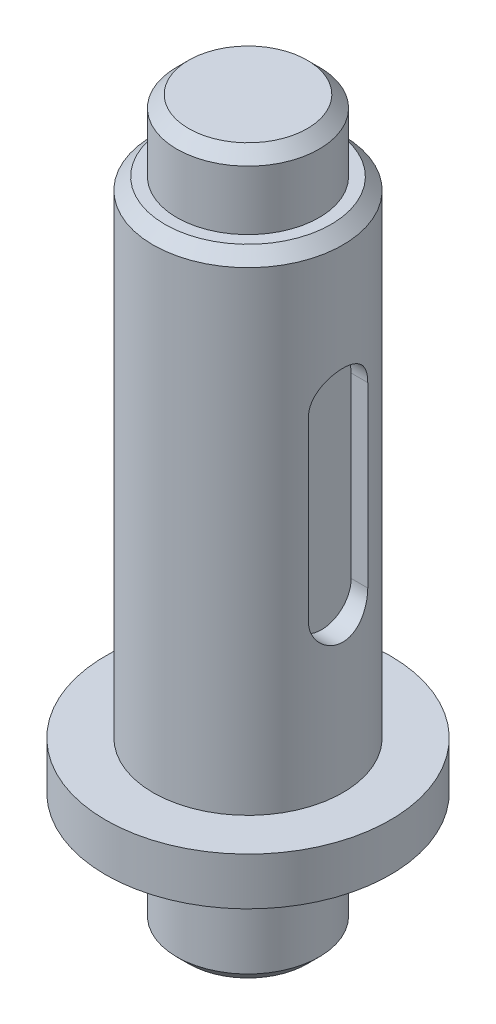
ISO-10303-21;
HEADER;
FILE_DESCRIPTION(('STEP AP214'),'2;1');
FILE_NAME('part.step','',(''),(''),'','','');
FILE_SCHEMA(('AUTOMOTIVE_DESIGN { 1 0 10303 214 1 1 1 1 }'));
ENDSEC;
DATA;
#1=APPLICATION_CONTEXT('core data for automotive mechanical design processes');
#2=APPLICATION_PROTOCOL_DEFINITION('international standard','automotive_design',2000,#1);
#3=PRODUCT_CONTEXT('',#1,'mechanical');
#4=PRODUCT('Part','Part','',(#3));
#5=PRODUCT_RELATED_PRODUCT_CATEGORY('part','',(#4));
#6=PRODUCT_DEFINITION_FORMATION('','',#4);
#7=PRODUCT_DEFINITION_CONTEXT('part definition',#1,'design');
#8=PRODUCT_DEFINITION('design','',#6,#7);
#9=PRODUCT_DEFINITION_SHAPE('','',#8);
#10=(LENGTH_UNIT() NAMED_UNIT(*) SI_UNIT(.MILLI.,.METRE.));
#11=(NAMED_UNIT(*) PLANE_ANGLE_UNIT() SI_UNIT($,.RADIAN.));
#12=(NAMED_UNIT(*) SI_UNIT($,.STERADIAN.) SOLID_ANGLE_UNIT());
#13=UNCERTAINTY_MEASURE_WITH_UNIT(LENGTH_MEASURE(1.E-05),#10,'distance_accuracy_value','');
#14=(GEOMETRIC_REPRESENTATION_CONTEXT(3) GLOBAL_UNCERTAINTY_ASSIGNED_CONTEXT((#13)) GLOBAL_UNIT_ASSIGNED_CONTEXT((#10,
#11,#12)) REPRESENTATION_CONTEXT('',''));
#15=CARTESIAN_POINT('',(0.,0.,0.));
#16=DIRECTION('',(0.,0.,1.));
#17=DIRECTION('',(1.,0.,0.));
#18=AXIS2_PLACEMENT_3D('',#15,#16,#17);
#19=CARTESIAN_POINT('',(0.,10.,0.));
#20=DIRECTION('',(0.,-1.,0.));
#21=DIRECTION('',(0.,0.,-1.));
#22=AXIS2_PLACEMENT_3D('',#19,#20,#21);
#23=CYLINDRICAL_SURFACE('',#22,6.);
#24=CARTESIAN_POINT('',(0.,1.00000000000001,0.));
#25=DIRECTION('',(0.,1.,0.));
#26=DIRECTION('',(0.,0.,1.));
#27=AXIS2_PLACEMENT_3D('',#24,#25,#26);
#28=CIRCLE('',#27,6.);
#29=CARTESIAN_POINT('',(0.,1.00000000000001,6.));
#30=VERTEX_POINT('',#29);
#31=EDGE_CURVE('E108',#30,#30,#28,.T.);
#32=ORIENTED_EDGE('',*,*,#31,.T.);
#33=EDGE_LOOP('',(#32));
#34=FACE_BOUND('',#33,.T.);
#35=CARTESIAN_POINT('',(0.,10.,0.));
#36=DIRECTION('',(0.,1.,0.));
#37=DIRECTION('',(0.,0.,1.));
#38=AXIS2_PLACEMENT_3D('',#35,#36,#37);
#39=CIRCLE('',#38,6.);
#40=CARTESIAN_POINT('',(0.,10.,6.));
#41=VERTEX_POINT('',#40);
#42=EDGE_CURVE('E112',#41,#41,#39,.T.);
#43=ORIENTED_EDGE('',*,*,#42,.F.);
#44=EDGE_LOOP('',(#43));
#45=FACE_BOUND('',#44,.T.);
#46=ADVANCED_FACE('F34',(#34,#45),#23,.T.);
#47=CARTESIAN_POINT('',(0.,0.,0.));
#48=DIRECTION('',(0.,1.,0.));
#49=DIRECTION('',(0.,0.,1.));
#50=AXIS2_PLACEMENT_3D('',#47,#48,#49);
#51=PLANE('',#50);
#52=CARTESIAN_POINT('',(0.,0.,0.));
#53=DIRECTION('',(0.,1.,0.));
#54=DIRECTION('',(0.,0.,1.));
#55=AXIS2_PLACEMENT_3D('',#52,#53,#54);
#56=CIRCLE('',#55,4.99999999999999);
#57=CARTESIAN_POINT('',(0.,0.,4.99999999999999));
#58=VERTEX_POINT('',#57);
#59=EDGE_CURVE('E122',#58,#58,#56,.F.);
#60=ORIENTED_EDGE('',*,*,#59,.T.);
#61=EDGE_LOOP('',(#60));
#62=FACE_BOUND('',#61,.T.);
#63=ADVANCED_FACE('F185',(#62),#51,.F.);
#64=CARTESIAN_POINT('',(0.,14.,0.));
#65=DIRECTION('',(0.,-1.,0.));
#66=DIRECTION('',(0.,0.,-1.));
#67=AXIS2_PLACEMENT_3D('',#64,#65,#66);
#68=CYLINDRICAL_SURFACE('',#67,12.);
#69=CARTESIAN_POINT('',(0.,14.,0.));
#70=DIRECTION('',(0.,1.,0.));
#71=DIRECTION('',(0.,0.,1.));
#72=AXIS2_PLACEMENT_3D('',#69,#70,#71);
#73=CIRCLE('',#72,12.);
#74=CARTESIAN_POINT('',(0.,14.,12.));
#75=VERTEX_POINT('',#74);
#76=EDGE_CURVE('E113',#75,#75,#73,.T.);
#77=ORIENTED_EDGE('',*,*,#76,.F.);
#78=EDGE_LOOP('',(#77));
#79=FACE_BOUND('',#78,.T.);
#80=CARTESIAN_POINT('',(0.,10.,0.));
#81=DIRECTION('',(0.,1.,0.));
#82=DIRECTION('',(0.,0.,1.));
#83=AXIS2_PLACEMENT_3D('',#80,#81,#82);
#84=CIRCLE('',#83,12.);
#85=CARTESIAN_POINT('',(0.,10.,12.));
#86=VERTEX_POINT('',#85);
#87=EDGE_CURVE('E101',#86,#86,#84,.T.);
#88=ORIENTED_EDGE('',*,*,#87,.T.);
#89=EDGE_LOOP('',(#88));
#90=FACE_BOUND('',#89,.T.);
#91=ADVANCED_FACE('F191',(#79,#90),#68,.T.);
#92=CARTESIAN_POINT('',(0.,14.,0.));
#93=DIRECTION('',(0.,1.,0.));
#94=DIRECTION('',(0.,0.,1.));
#95=AXIS2_PLACEMENT_3D('',#92,#93,#94);
#96=PLANE('',#95);
#97=CARTESIAN_POINT('',(0.,14.,0.));
#98=DIRECTION('',(0.,1.,0.));
#99=DIRECTION('',(0.,0.,1.));
#100=AXIS2_PLACEMENT_3D('',#97,#98,#99);
#101=CIRCLE('',#100,8.);
#102=CARTESIAN_POINT('',(0.,14.,8.));
#103=VERTEX_POINT('',#102);
#104=EDGE_CURVE('E109',#103,#103,#101,.T.);
#105=ORIENTED_EDGE('',*,*,#104,.F.);
#106=EDGE_LOOP('',(#105));
#107=FACE_BOUND('',#106,.T.);
#108=ORIENTED_EDGE('',*,*,#76,.T.);
#109=EDGE_LOOP('',(#108));
#110=FACE_BOUND('',#109,.T.);
#111=ADVANCED_FACE('F226',(#107,#110),#96,.T.);
#112=CARTESIAN_POINT('',(0.,10.,0.));
#113=DIRECTION('',(0.,1.,0.));
#114=DIRECTION('',(0.,0.,1.));
#115=AXIS2_PLACEMENT_3D('',#112,#113,#114);
#116=PLANE('',#115);
#117=ORIENTED_EDGE('',*,*,#42,.T.);
#118=EDGE_LOOP('',(#117));
#119=FACE_BOUND('',#118,.T.);
#120=ORIENTED_EDGE('',*,*,#87,.F.);
#121=EDGE_LOOP('',(#120));
#122=FACE_BOUND('',#121,.T.);
#123=ADVANCED_FACE('F181',(#119,#122),#116,.F.);
#124=CARTESIAN_POINT('',(0.,55.,0.));
#125=DIRECTION('',(0.,-1.,0.));
#126=DIRECTION('',(0.,0.,-1.));
#127=AXIS2_PLACEMENT_3D('',#124,#125,#126);
#128=CYLINDRICAL_SURFACE('',#127,8.);
#129=DIRECTION('',(0.,-1.,0.));
#130=VECTOR('',#129,1.);
#131=CARTESIAN_POINT('',(7.59934207678533,55.,-2.5));
#132=LINE('',#131,#130);
#133=CARTESIAN_POINT('',(7.59934207678533,42.5,-2.5));
#134=VERTEX_POINT('',#133);
#135=CARTESIAN_POINT('',(7.59934207678533,27.5,-2.5));
#136=VERTEX_POINT('',#135);
#137=EDGE_CURVE('E11',#134,#136,#132,.T.);
#138=ORIENTED_EDGE('',*,*,#137,.T.);
#139=CARTESIAN_POINT('',(7.59934207678533,27.5,-2.5));
#140=CARTESIAN_POINT('',(7.59933203220922,27.431533959542,-2.50000871986611));
#141=CARTESIAN_POINT('',(7.60026710840752,27.3630736199713,-2.4971876157067));
#142=CARTESIAN_POINT('',(7.60395280971297,27.2266785097404,-2.48595363160138));
#143=CARTESIAN_POINT('',(7.60670299725467,27.1587436164041,-2.47754209932593));
#144=CARTESIAN_POINT('',(7.61393458112745,27.0240610094841,-2.45522504986812));
#145=CARTESIAN_POINT('',(7.61841131278036,26.9573105997033,-2.44133433374918));
#146=CARTESIAN_POINT('',(7.6289504842887,26.8252980221065,-2.40819742021323));
#147=CARTESIAN_POINT('',(7.63501297127917,26.760035898591,-2.38895106360389));
#148=CARTESIAN_POINT('',(7.65531370854753,26.5672122235932,-2.32342181812057));
#149=CARTESIAN_POINT('',(7.67167572075674,26.4424319419261,-2.26931834783614));
#150=CARTESIAN_POINT('',(7.70820192005305,26.2037124302177,-2.1419585337528));
#151=CARTESIAN_POINT('',(7.72836808096863,26.0897788745153,-2.06869223942944));
#152=CARTESIAN_POINT('',(7.77100200100207,25.8720500238271,-1.90239488450143));
#153=CARTESIAN_POINT('',(7.79352168290434,25.7686777356114,-1.80882220629732));
#154=CARTESIAN_POINT('',(7.83788426191899,25.5788091827044,-1.60572727956463));
#155=CARTESIAN_POINT('',(7.85972704204464,25.4923158216107,-1.49620229248912));
#156=CARTESIAN_POINT('',(7.90087147079049,25.3367767359159,-1.26124953771773));
#157=CARTESIAN_POINT('',(7.92010445950432,25.2681699526331,-1.13551807880448));
#158=CARTESIAN_POINT('',(7.95325160259884,25.1532459150217,-0.873602960335169));
#159=CARTESIAN_POINT('',(7.96716721976608,25.106922529715,-0.737422187737948));
#160=CARTESIAN_POINT('',(7.98774341182992,25.0392981140107,-0.462930099011999));
#161=CARTESIAN_POINT('',(7.99461464054537,25.0172689552531,-0.324814247508668));
#162=CARTESIAN_POINT('',(8.00107192504111,24.9965512744954,-0.0466844774607918));
#163=CARTESIAN_POINT('',(8.00065948912979,24.9978579200948,0.0933290421121669));
#164=CARTESIAN_POINT('',(7.99274230032515,25.0232966545975,0.366149731450021));
#165=CARTESIAN_POINT('',(7.98548293529422,25.0466390281483,0.499038795981164));
#166=CARTESIAN_POINT('',(7.96498949974384,25.1141904955611,0.758907586787322));
#167=CARTESIAN_POINT('',(7.95175510801139,25.1584007112687,0.885886994958718));
#168=CARTESIAN_POINT('',(7.92046911120711,25.2669406330595,1.13215685546553));
#169=CARTESIAN_POINT('',(7.90236047967987,25.33151017529,1.2513340594516));
#170=CARTESIAN_POINT('',(7.86323423851861,25.478743196476,1.47740616192354));
#171=CARTESIAN_POINT('',(7.84221592430771,25.5614110607507,1.58429807402893));
#172=CARTESIAN_POINT('',(7.79847545376802,25.7465381363962,1.78746586607462));
#173=CARTESIAN_POINT('',(7.77571879037653,25.8496774077316,1.88311543585898));
#174=CARTESIAN_POINT('',(7.73181622612155,26.0707703101051,2.05596538849195));
#175=CARTESIAN_POINT('',(7.71067081193134,26.1887283888502,2.13316021206709));
#176=CARTESIAN_POINT('',(7.67220528704821,26.4379029431861,2.26764925997605));
#177=CARTESIAN_POINT('',(7.65493278862476,26.5692583014659,2.32470027293309));
#178=CARTESIAN_POINT('',(7.62673815128782,26.8403118730474,2.41560912229749));
#179=CARTESIAN_POINT('',(7.61580620458632,26.9799968306881,2.44950279382811));
#180=CARTESIAN_POINT('',(7.60564225124819,27.1841751010082,2.48078343133095));
#181=CARTESIAN_POINT('',(7.60328541577438,27.2471449369418,2.48798807259048));
#182=CARTESIAN_POINT('',(7.60013482131107,27.3733989933458,2.49759244704775));
#183=CARTESIAN_POINT('',(7.59933885501905,27.4366826427974,2.4999989655896));
#184=CARTESIAN_POINT('',(7.59934207678533,27.5,2.5));
#185=B_SPLINE_CURVE_WITH_KNOTS('',3,(#139,#140,#141,#142,#143,#144,#145,#146,#147,#148,#149,
#150,#151,#152,#153,#154,#155,#156,#157,#158,#159,#160,#161,#162,#163,#164,#165,#166,#167,#168,
#169,#170,#171,#172,#173,#174,#175,#176,#177,#178,#179,#180,#181,#182,#183,#184),.UNSPECIFIED.,
.F.,.F.,(4,2,2,2,2,2,2,2,2,2,2,2,2,2,2,2,2,2,2,2,2,2,4),(0.,0.205323959879022,0.410598440771334,
0.615322164613759,0.820051974362703,1.22896577749256,1.63809233699274,2.05988351400979,
2.48174718582288,2.91315381297358,3.34444167638914,3.7624189439242,4.18030965733328,
4.58377069824372,4.98725343150324,5.39567896994655,5.80420358180209,6.2297165423683,
6.6553575226076,7.0859747210149,7.51592403685477,7.70602799872316,7.89586293072483),.UNSPECIFIED.);
#186=CARTESIAN_POINT('',(7.59934207678533,27.5,2.5));
#187=VERTEX_POINT('',#186);
#188=EDGE_CURVE('E137',#136,#187,#185,.T.);
#189=ORIENTED_EDGE('',*,*,#188,.T.);
#190=DIRECTION('',(0.,-1.,0.));
#191=VECTOR('',#190,1.);
#192=CARTESIAN_POINT('',(7.59934207678533,55.,2.5));
#193=LINE('',#192,#191);
#194=CARTESIAN_POINT('',(7.59934207678533,42.5,2.5));
#195=VERTEX_POINT('',#194);
#196=EDGE_CURVE('E43',#187,#195,#193,.F.);
#197=ORIENTED_EDGE('',*,*,#196,.T.);
#198=CARTESIAN_POINT('',(7.59934207678533,42.5,2.5));
#199=CARTESIAN_POINT('',(7.59933203220923,42.5684660404579,2.5000087198661));
#200=CARTESIAN_POINT('',(7.60026710840753,42.6369263800287,2.4971876157067));
#201=CARTESIAN_POINT('',(7.60395280971297,42.7733214902596,2.48595363160137));
#202=CARTESIAN_POINT('',(7.60670299725468,42.8412563835959,2.47754209932592));
#203=CARTESIAN_POINT('',(7.61393458112745,42.9759389905158,2.45522504986811));
#204=CARTESIAN_POINT('',(7.61841131278037,43.0426894002966,2.44133433374918));
#205=CARTESIAN_POINT('',(7.6289504842887,43.1747019778935,2.40819742021322));
#206=CARTESIAN_POINT('',(7.63501297127917,43.2399641014089,2.38895106360388));
#207=CARTESIAN_POINT('',(7.65531370854753,43.4327877764068,2.32342181812057));
#208=CARTESIAN_POINT('',(7.67167572075674,43.5575680580739,2.26931834783614));
#209=CARTESIAN_POINT('',(7.70820192005305,43.7962875697823,2.1419585337528));
#210=CARTESIAN_POINT('',(7.72836808096863,43.9102211254847,2.06869223942944));
#211=CARTESIAN_POINT('',(7.77100200100207,44.1279499761729,1.90239488450142));
#212=CARTESIAN_POINT('',(7.79352168290434,44.2313222643886,1.80882220629731));
#213=CARTESIAN_POINT('',(7.83788426191899,44.4211908172956,1.60572727956463));
#214=CARTESIAN_POINT('',(7.85972704204464,44.5076841783893,1.49620229248911));
#215=CARTESIAN_POINT('',(7.90087147079049,44.6632232640841,1.26124953771773));
#216=CARTESIAN_POINT('',(7.92010445950432,44.7318300473669,1.13551807880448));
#217=CARTESIAN_POINT('',(7.95325160259884,44.8467540849783,0.87360296033517));
#218=CARTESIAN_POINT('',(7.96716721976608,44.893077470285,0.737422187737948));
#219=CARTESIAN_POINT('',(7.98774341182992,44.9607018859892,0.462930099011998));
#220=CARTESIAN_POINT('',(7.99461464054537,44.9827310447469,0.324814247508667));
#221=CARTESIAN_POINT('',(8.00107192504111,45.0034487255046,0.0466844774607901));
#222=CARTESIAN_POINT('',(8.00065948912979,45.0021420799052,-0.0933290421121691));
#223=CARTESIAN_POINT('',(7.99274230032515,44.9767033454025,-0.366149731450024));
#224=CARTESIAN_POINT('',(7.98548293529422,44.9533609718517,-0.499038795981168));
#225=CARTESIAN_POINT('',(7.96498949974384,44.8858095044389,-0.758907586787326));
#226=CARTESIAN_POINT('',(7.95175510801139,44.8415992887313,-0.885886994958722));
#227=CARTESIAN_POINT('',(7.92046911120711,44.7330593669404,-1.13215685546553));
#228=CARTESIAN_POINT('',(7.90236047967987,44.66848982471,-1.2513340594516));
#229=CARTESIAN_POINT('',(7.86323423851861,44.521256803524,-1.47740616192355));
#230=CARTESIAN_POINT('',(7.84221592430771,44.4385889392493,-1.58429807402893));
#231=CARTESIAN_POINT('',(7.79847545376802,44.2534618636038,-1.78746586607462));
#232=CARTESIAN_POINT('',(7.77571879037652,44.1503225922683,-1.88311543585898));
#233=CARTESIAN_POINT('',(7.73181622612155,43.9292296898949,-2.05596538849195));
#234=CARTESIAN_POINT('',(7.71067081193134,43.8112716111498,-2.13316021206709));
#235=CARTESIAN_POINT('',(7.67220528704821,43.5620970568139,-2.26764925997605));
#236=CARTESIAN_POINT('',(7.65493278862476,43.4307416985341,-2.32470027293309));
#237=CARTESIAN_POINT('',(7.62673815128782,43.1596881269526,-2.4156091222975));
#238=CARTESIAN_POINT('',(7.61580620458632,43.0200031693119,-2.44950279382811));
#239=CARTESIAN_POINT('',(7.60564225124819,42.8158248989917,-2.48078343133095));
#240=CARTESIAN_POINT('',(7.60328541577438,42.7528550630581,-2.48798807259048));
#241=CARTESIAN_POINT('',(7.60013482131107,42.6266010066542,-2.49759244704776));
#242=CARTESIAN_POINT('',(7.59933885501905,42.5633173572026,-2.4999989655896));
#243=CARTESIAN_POINT('',(7.59934207678533,42.5,-2.5));
#244=B_SPLINE_CURVE_WITH_KNOTS('',3,(#198,#199,#200,#201,#202,#203,#204,#205,#206,#207,#208,
#209,#210,#211,#212,#213,#214,#215,#216,#217,#218,#219,#220,#221,#222,#223,#224,#225,#226,#227,
#228,#229,#230,#231,#232,#233,#234,#235,#236,#237,#238,#239,#240,#241,#242,#243),.UNSPECIFIED.,
.F.,.F.,(4,2,2,2,2,2,2,2,2,2,2,2,2,2,2,2,2,2,2,2,2,2,4),(0.,0.205323959879025,0.410598440771331,
0.615322164613755,0.820051974362703,1.22896577749255,1.63809233699273,2.05988351400979,
2.48174718582287,2.91315381297357,3.34444167638913,3.76241894392419,4.18030965733327,
4.58377069824371,4.98725343150324,5.39567896994655,5.80420358180209,6.2297165423683,
6.6553575226076,7.08597472101489,7.51592403685478,7.70602799872317,7.89586293072483),.UNSPECIFIED.);
#245=EDGE_CURVE('E50',#195,#134,#244,.T.);
#246=ORIENTED_EDGE('',*,*,#245,.T.);
#247=EDGE_LOOP('',(#138,#189,#197,#246));
#248=FACE_BOUND('',#247,.T.);
#249=CARTESIAN_POINT('',(0.,54.,0.));
#250=DIRECTION('',(0.,1.,0.));
#251=DIRECTION('',(0.,0.,1.));
#252=AXIS2_PLACEMENT_3D('',#249,#250,#251);
#253=CIRCLE('',#252,8.);
#254=CARTESIAN_POINT('',(0.,54.,8.));
#255=VERTEX_POINT('',#254);
#256=EDGE_CURVE('E134',#255,#255,#253,.F.);
#257=ORIENTED_EDGE('',*,*,#256,.T.);
#258=EDGE_LOOP('',(#257));
#259=FACE_BOUND('',#258,.T.);
#260=ORIENTED_EDGE('',*,*,#104,.T.);
#261=EDGE_LOOP('',(#260));
#262=FACE_BOUND('',#261,.T.);
#263=ADVANCED_FACE('F151',(#248,#259,#262),#128,.T.);
#264=CARTESIAN_POINT('',(0.,55.,0.));
#265=DIRECTION('',(0.,1.,0.));
#266=DIRECTION('',(0.,0.,1.));
#267=AXIS2_PLACEMENT_3D('',#264,#265,#266);
#268=PLANE('',#267);
#269=CARTESIAN_POINT('',(0.,55.,0.));
#270=DIRECTION('',(0.,1.,0.));
#271=DIRECTION('',(0.,0.,1.));
#272=AXIS2_PLACEMENT_3D('',#269,#270,#271);
#273=CIRCLE('',#272,7.);
#274=CARTESIAN_POINT('',(0.,55.,7.));
#275=VERTEX_POINT('',#274);
#276=EDGE_CURVE('E131',#275,#275,#273,.T.);
#277=ORIENTED_EDGE('',*,*,#276,.T.);
#278=EDGE_LOOP('',(#277));
#279=FACE_BOUND('',#278,.T.);
#280=CARTESIAN_POINT('',(0.,55.,0.));
#281=DIRECTION('',(0.,1.,0.));
#282=DIRECTION('',(0.,0.,1.));
#283=AXIS2_PLACEMENT_3D('',#280,#281,#282);
#284=CIRCLE('',#283,6.);
#285=CARTESIAN_POINT('',(0.,55.,6.));
#286=VERTEX_POINT('',#285);
#287=EDGE_CURVE('E105',#286,#286,#284,.T.);
#288=ORIENTED_EDGE('',*,*,#287,.F.);
#289=EDGE_LOOP('',(#288));
#290=FACE_BOUND('',#289,.T.);
#291=ADVANCED_FACE('F174',(#279,#290),#268,.T.);
#292=CARTESIAN_POINT('',(0.,61.,0.));
#293=DIRECTION('',(0.,-1.,0.));
#294=DIRECTION('',(0.,0.,-1.));
#295=AXIS2_PLACEMENT_3D('',#292,#293,#294);
#296=CYLINDRICAL_SURFACE('',#295,6.);
#297=CARTESIAN_POINT('',(0.,60.,0.));
#298=DIRECTION('',(0.,1.,0.));
#299=DIRECTION('',(0.,0.,1.));
#300=AXIS2_PLACEMENT_3D('',#297,#298,#299);
#301=CIRCLE('',#300,6.);
#302=CARTESIAN_POINT('',(0.,60.,6.));
#303=VERTEX_POINT('',#302);
#304=EDGE_CURVE('E128',#303,#303,#301,.F.);
#305=ORIENTED_EDGE('',*,*,#304,.T.);
#306=EDGE_LOOP('',(#305));
#307=FACE_BOUND('',#306,.T.);
#308=ORIENTED_EDGE('',*,*,#287,.T.);
#309=EDGE_LOOP('',(#308));
#310=FACE_BOUND('',#309,.T.);
#311=ADVANCED_FACE('F171',(#307,#310),#296,.T.);
#312=CARTESIAN_POINT('',(0.,61.,0.));
#313=DIRECTION('',(0.,1.,0.));
#314=DIRECTION('',(0.,0.,1.));
#315=AXIS2_PLACEMENT_3D('',#312,#313,#314);
#316=PLANE('',#315);
#317=CARTESIAN_POINT('',(0.,61.,0.));
#318=DIRECTION('',(0.,1.,0.));
#319=DIRECTION('',(0.,0.,1.));
#320=AXIS2_PLACEMENT_3D('',#317,#318,#319);
#321=CIRCLE('',#320,5.00000000000001);
#322=CARTESIAN_POINT('',(0.,61.,5.00000000000001));
#323=VERTEX_POINT('',#322);
#324=EDGE_CURVE('E125',#323,#323,#321,.T.);
#325=ORIENTED_EDGE('',*,*,#324,.T.);
#326=EDGE_LOOP('',(#325));
#327=FACE_BOUND('',#326,.T.);
#328=ADVANCED_FACE('F167',(#327),#316,.T.);
#329=CARTESIAN_POINT('',(0.,1.00000000000001,0.));
#330=DIRECTION('',(0.,1.,0.));
#331=DIRECTION('',(0.,0.,1.));
#332=AXIS2_PLACEMENT_3D('',#329,#330,#331);
#333=CONICAL_SURFACE('',#332,6.,0.785398163397448);
#334=ORIENTED_EDGE('',*,*,#59,.F.);
#335=EDGE_LOOP('',(#334));
#336=FACE_BOUND('',#335,.T.);
#337=ORIENTED_EDGE('',*,*,#31,.F.);
#338=EDGE_LOOP('',(#337));
#339=FACE_BOUND('',#338,.T.);
#340=ADVANCED_FACE('F170',(#336,#339),#333,.T.);
#341=CARTESIAN_POINT('',(0.,61.,0.));
#342=DIRECTION('',(0.,-1.,0.));
#343=DIRECTION('',(0.,0.,-1.));
#344=AXIS2_PLACEMENT_3D('',#341,#342,#343);
#345=CONICAL_SURFACE('',#344,5.00000000000001,0.78539816339745);
#346=ORIENTED_EDGE('',*,*,#304,.F.);
#347=EDGE_LOOP('',(#346));
#348=FACE_BOUND('',#347,.T.);
#349=ORIENTED_EDGE('',*,*,#324,.F.);
#350=EDGE_LOOP('',(#349));
#351=FACE_BOUND('',#350,.T.);
#352=ADVANCED_FACE('F202',(#348,#351),#345,.T.);
#353=CARTESIAN_POINT('',(0.,55.,0.));
#354=DIRECTION('',(0.,-1.,0.));
#355=DIRECTION('',(0.,0.,-1.));
#356=AXIS2_PLACEMENT_3D('',#353,#354,#355);
#357=CONICAL_SURFACE('',#356,7.,0.785398163397448);
#358=ORIENTED_EDGE('',*,*,#256,.F.);
#359=EDGE_LOOP('',(#358));
#360=FACE_BOUND('',#359,.T.);
#361=ORIENTED_EDGE('',*,*,#276,.F.);
#362=EDGE_LOOP('',(#361));
#363=FACE_BOUND('',#362,.T.);
#364=ADVANCED_FACE('F37',(#360,#363),#357,.T.);
#365=CARTESIAN_POINT('',(6.2,42.5,0.));
#366=DIRECTION('',(1.,0.,0.));
#367=DIRECTION('',(0.,0.,-1.));
#368=AXIS2_PLACEMENT_3D('',#365,#366,#367);
#369=CYLINDRICAL_SURFACE('',#368,2.5);
#370=DIRECTION('',(1.,0.,0.));
#371=VECTOR('',#370,1.);
#372=CARTESIAN_POINT('',(6.2,42.5,2.5));
#373=LINE('',#372,#371);
#374=CARTESIAN_POINT('',(6.2,42.5,2.5));
#375=VERTEX_POINT('',#374);
#376=EDGE_CURVE('E73',#375,#195,#373,.T.);
#377=ORIENTED_EDGE('',*,*,#376,.F.);
#378=CARTESIAN_POINT('',(6.2,42.5,0.));
#379=DIRECTION('',(1.,0.,0.));
#380=DIRECTION('',(0.,0.,-1.));
#381=AXIS2_PLACEMENT_3D('',#378,#379,#380);
#382=CIRCLE('',#381,2.5);
#383=CARTESIAN_POINT('',(6.2,42.5,-2.5));
#384=VERTEX_POINT('',#383);
#385=EDGE_CURVE('E77',#384,#375,#382,.T.);
#386=ORIENTED_EDGE('',*,*,#385,.F.);
#387=DIRECTION('',(1.,0.,0.));
#388=VECTOR('',#387,1.);
#389=CARTESIAN_POINT('',(6.2,42.5,-2.5));
#390=LINE('',#389,#388);
#391=EDGE_CURVE('E99',#384,#134,#390,.T.);
#392=ORIENTED_EDGE('',*,*,#391,.T.);
#393=ORIENTED_EDGE('',*,*,#245,.F.);
#394=EDGE_LOOP('',(#377,#386,#392,#393));
#395=FACE_BOUND('',#394,.T.);
#396=ADVANCED_FACE('F75',(#395),#369,.F.);
#397=CARTESIAN_POINT('',(6.2,42.5,-2.5));
#398=DIRECTION('',(0.,0.,-1.));
#399=DIRECTION('',(0.,1.,0.));
#400=AXIS2_PLACEMENT_3D('',#397,#398,#399);
#401=PLANE('',#400);
#402=ORIENTED_EDGE('',*,*,#391,.F.);
#403=DIRECTION('',(0.,1.,0.));
#404=VECTOR('',#403,1.);
#405=CARTESIAN_POINT('',(6.2,42.5,-2.5));
#406=LINE('',#405,#404);
#407=CARTESIAN_POINT('',(6.2,27.5,-2.5));
#408=VERTEX_POINT('',#407);
#409=EDGE_CURVE('E82',#408,#384,#406,.T.);
#410=ORIENTED_EDGE('',*,*,#409,.F.);
#411=DIRECTION('',(1.,0.,0.));
#412=VECTOR('',#411,1.);
#413=CARTESIAN_POINT('',(6.2,27.5,-2.5));
#414=LINE('',#413,#412);
#415=EDGE_CURVE('E102',#408,#136,#414,.T.);
#416=ORIENTED_EDGE('',*,*,#415,.T.);
#417=ORIENTED_EDGE('',*,*,#137,.F.);
#418=EDGE_LOOP('',(#402,#410,#416,#417));
#419=FACE_BOUND('',#418,.T.);
#420=ADVANCED_FACE('F160',(#419),#401,.F.);
#421=CARTESIAN_POINT('',(6.2,27.5,0.));
#422=DIRECTION('',(1.,0.,0.));
#423=DIRECTION('',(0.,0.,-1.));
#424=AXIS2_PLACEMENT_3D('',#421,#422,#423);
#425=CYLINDRICAL_SURFACE('',#424,2.5);
#426=ORIENTED_EDGE('',*,*,#415,.F.);
#427=CARTESIAN_POINT('',(6.2,27.5,0.));
#428=DIRECTION('',(1.,0.,0.));
#429=DIRECTION('',(0.,0.,-1.));
#430=AXIS2_PLACEMENT_3D('',#427,#428,#429);
#431=CIRCLE('',#430,2.5);
#432=CARTESIAN_POINT('',(6.2,27.5,2.5));
#433=VERTEX_POINT('',#432);
#434=EDGE_CURVE('E91',#433,#408,#431,.T.);
#435=ORIENTED_EDGE('',*,*,#434,.F.);
#436=DIRECTION('',(1.,0.,0.));
#437=VECTOR('',#436,1.);
#438=CARTESIAN_POINT('',(6.2,27.5,2.5));
#439=LINE('',#438,#437);
#440=EDGE_CURVE('E81',#433,#187,#439,.T.);
#441=ORIENTED_EDGE('',*,*,#440,.T.);
#442=ORIENTED_EDGE('',*,*,#188,.F.);
#443=EDGE_LOOP('',(#426,#435,#441,#442));
#444=FACE_BOUND('',#443,.T.);
#445=ADVANCED_FACE('F155',(#444),#425,.F.);
#446=CARTESIAN_POINT('',(6.2,42.5,2.5));
#447=DIRECTION('',(0.,0.,1.));
#448=DIRECTION('',(0.,-1.,0.));
#449=AXIS2_PLACEMENT_3D('',#446,#447,#448);
#450=PLANE('',#449);
#451=ORIENTED_EDGE('',*,*,#440,.F.);
#452=DIRECTION('',(0.,-1.,0.));
#453=VECTOR('',#452,1.);
#454=CARTESIAN_POINT('',(6.2,42.5,2.5));
#455=LINE('',#454,#453);
#456=EDGE_CURVE('E85',#375,#433,#455,.T.);
#457=ORIENTED_EDGE('',*,*,#456,.F.);
#458=ORIENTED_EDGE('',*,*,#376,.T.);
#459=ORIENTED_EDGE('',*,*,#196,.F.);
#460=EDGE_LOOP('',(#451,#457,#458,#459));
#461=FACE_BOUND('',#460,.T.);
#462=ADVANCED_FACE('F86',(#461),#450,.F.);
#463=CARTESIAN_POINT('',(6.2,42.5,0.));
#464=DIRECTION('',(1.,0.,0.));
#465=DIRECTION('',(0.,0.,-1.));
#466=AXIS2_PLACEMENT_3D('',#463,#464,#465);
#467=PLANE('',#466);
#468=ORIENTED_EDGE('',*,*,#385,.T.);
#469=ORIENTED_EDGE('',*,*,#456,.T.);
#470=ORIENTED_EDGE('',*,*,#434,.T.);
#471=ORIENTED_EDGE('',*,*,#409,.T.);
#472=EDGE_LOOP('',(#468,#469,#470,#471));
#473=FACE_BOUND('',#472,.T.);
#474=ADVANCED_FACE('F93',(#473),#467,.T.);
#475=CLOSED_SHELL('',(#46,#63,#91,#111,#123,#263,#291,#311,#328,#340,#352,#364,#396,#420,#445,
#462,#474));
#476=MANIFOLD_SOLID_BREP('B2',#475);
#477=ADVANCED_BREP_SHAPE_REPRESENTATION('',(#18,#476),#14);
#478=SHAPE_DEFINITION_REPRESENTATION(#9,#477);
ENDSEC;
END-ISO-10303-21;
